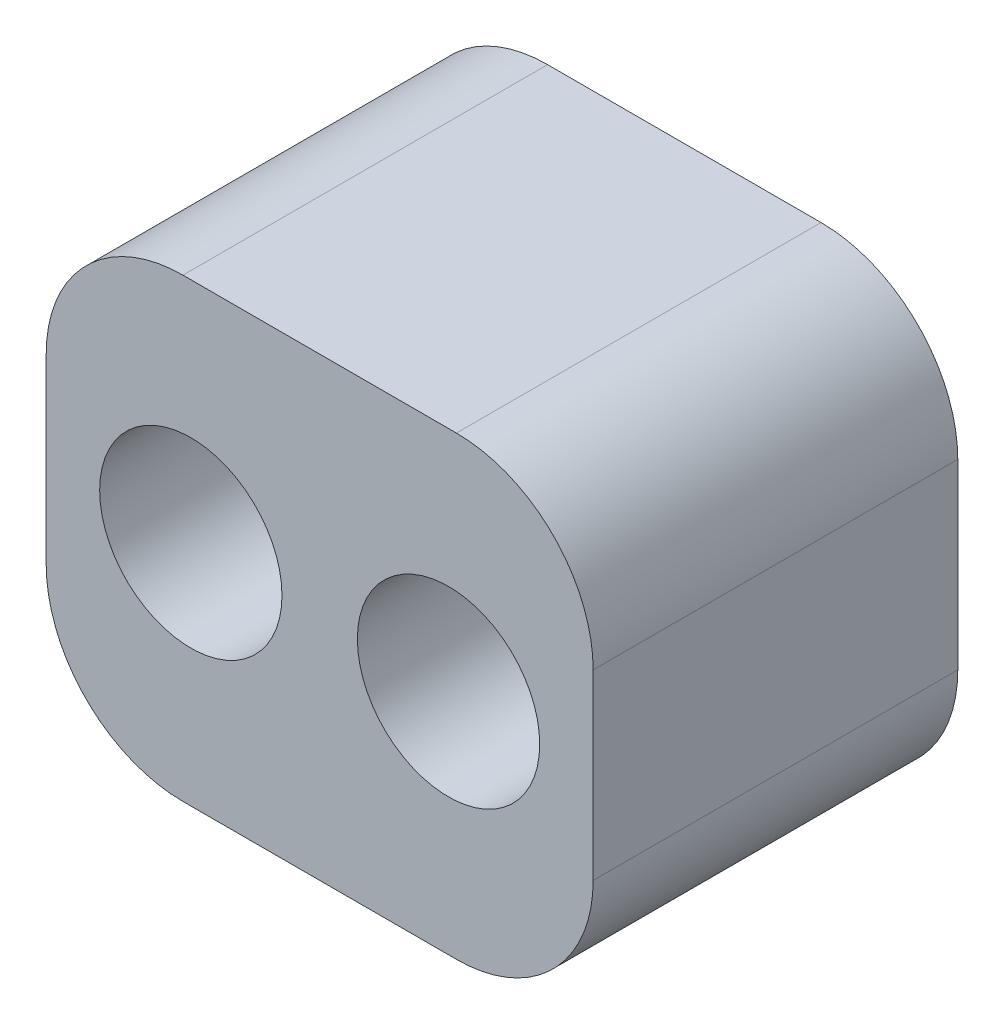
ISO-10303-21;
HEADER;
FILE_DESCRIPTION(('STEP AP214'),'2;1');
FILE_NAME('part.step','',(''),(''),'','','');
FILE_SCHEMA(('AUTOMOTIVE_DESIGN { 1 0 10303 214 1 1 1 1 }'));
ENDSEC;
DATA;
#1=APPLICATION_CONTEXT('core data for automotive mechanical design processes');
#2=APPLICATION_PROTOCOL_DEFINITION('international standard','automotive_design',2000,#1);
#3=PRODUCT_CONTEXT('',#1,'mechanical');
#4=PRODUCT('Part','Part','',(#3));
#5=PRODUCT_RELATED_PRODUCT_CATEGORY('part','',(#4));
#6=PRODUCT_DEFINITION_FORMATION('','',#4);
#7=PRODUCT_DEFINITION_CONTEXT('part definition',#1,'design');
#8=PRODUCT_DEFINITION('design','',#6,#7);
#9=PRODUCT_DEFINITION_SHAPE('','',#8);
#10=(LENGTH_UNIT() NAMED_UNIT(*) SI_UNIT(.MILLI.,.METRE.));
#11=(NAMED_UNIT(*) PLANE_ANGLE_UNIT() SI_UNIT($,.RADIAN.));
#12=(NAMED_UNIT(*) SI_UNIT($,.STERADIAN.) SOLID_ANGLE_UNIT());
#13=UNCERTAINTY_MEASURE_WITH_UNIT(LENGTH_MEASURE(1.E-05),#10,'distance_accuracy_value','');
#14=(GEOMETRIC_REPRESENTATION_CONTEXT(3) GLOBAL_UNCERTAINTY_ASSIGNED_CONTEXT((#13)) GLOBAL_UNIT_ASSIGNED_CONTEXT((#10,
#11,#12)) REPRESENTATION_CONTEXT('',''));
#15=CARTESIAN_POINT('',(0.,0.,0.));
#16=DIRECTION('',(0.,0.,1.));
#17=DIRECTION('',(1.,0.,0.));
#18=AXIS2_PLACEMENT_3D('',#15,#16,#17);
#19=CARTESIAN_POINT('',(0.,0.,4.));
#20=DIRECTION('',(0.,0.,1.));
#21=DIRECTION('',(1.,0.,0.));
#22=AXIS2_PLACEMENT_3D('',#19,#20,#21);
#23=PLANE('',#22);
#24=CARTESIAN_POINT('',(1.41362554394618,0.,4.));
#25=DIRECTION('',(0.,0.,1.));
#26=DIRECTION('',(1.,0.,0.));
#27=AXIS2_PLACEMENT_3D('',#24,#25,#26);
#28=CIRCLE('',#27,1.);
#29=CARTESIAN_POINT('',(2.41362554394618,0.,4.));
#30=VERTEX_POINT('',#29);
#31=EDGE_CURVE('E135',#30,#30,#28,.T.);
#32=ORIENTED_EDGE('',*,*,#31,.F.);
#33=EDGE_LOOP('',(#32));
#34=FACE_BOUND('',#33,.T.);
#35=DIRECTION('',(1.,0.,0.));
#36=VECTOR('',#35,1.);
#37=CARTESIAN_POINT('',(-3.,-2.5,4.));
#38=LINE('',#37,#36);
#39=CARTESIAN_POINT('',(-1.5,-2.5,4.));
#40=VERTEX_POINT('',#39);
#41=CARTESIAN_POINT('',(1.5,-2.5,4.));
#42=VERTEX_POINT('',#41);
#43=EDGE_CURVE('E144',#40,#42,#38,.T.);
#44=ORIENTED_EDGE('',*,*,#43,.T.);
#45=CARTESIAN_POINT('',(1.5,-1.,4.));
#46=DIRECTION('',(0.,0.,1.));
#47=DIRECTION('',(1.,0.,0.));
#48=AXIS2_PLACEMENT_3D('',#45,#46,#47);
#49=CIRCLE('',#48,1.5);
#50=CARTESIAN_POINT('',(3.,-1.,4.));
#51=VERTEX_POINT('',#50);
#52=EDGE_CURVE('E162',#42,#51,#49,.T.);
#53=ORIENTED_EDGE('',*,*,#52,.T.);
#54=DIRECTION('',(0.,1.,0.));
#55=VECTOR('',#54,1.);
#56=CARTESIAN_POINT('',(3.,2.5,4.));
#57=LINE('',#56,#55);
#58=CARTESIAN_POINT('',(3.,1.,4.));
#59=VERTEX_POINT('',#58);
#60=EDGE_CURVE('E126',#51,#59,#57,.T.);
#61=ORIENTED_EDGE('',*,*,#60,.T.);
#62=CARTESIAN_POINT('',(1.5,1.,4.));
#63=DIRECTION('',(0.,0.,1.));
#64=DIRECTION('',(1.,0.,0.));
#65=AXIS2_PLACEMENT_3D('',#62,#63,#64);
#66=CIRCLE('',#65,1.5);
#67=CARTESIAN_POINT('',(1.5,2.5,4.));
#68=VERTEX_POINT('',#67);
#69=EDGE_CURVE('E158',#59,#68,#66,.T.);
#70=ORIENTED_EDGE('',*,*,#69,.T.);
#71=DIRECTION('',(-1.,0.,0.));
#72=VECTOR('',#71,1.);
#73=CARTESIAN_POINT('',(-3.,2.5,4.));
#74=LINE('',#73,#72);
#75=CARTESIAN_POINT('',(-1.5,2.5,4.));
#76=VERTEX_POINT('',#75);
#77=EDGE_CURVE('E171',#68,#76,#74,.T.);
#78=ORIENTED_EDGE('',*,*,#77,.T.);
#79=CARTESIAN_POINT('',(-1.5,1.,4.));
#80=DIRECTION('',(0.,0.,1.));
#81=DIRECTION('',(1.,0.,0.));
#82=AXIS2_PLACEMENT_3D('',#79,#80,#81);
#83=CIRCLE('',#82,1.5);
#84=CARTESIAN_POINT('',(-3.,1.,4.));
#85=VERTEX_POINT('',#84);
#86=EDGE_CURVE('E61',#76,#85,#83,.T.);
#87=ORIENTED_EDGE('',*,*,#86,.T.);
#88=DIRECTION('',(0.,-1.,0.));
#89=VECTOR('',#88,1.);
#90=CARTESIAN_POINT('',(-3.,2.5,4.));
#91=LINE('',#90,#89);
#92=CARTESIAN_POINT('',(-3.,-1.,4.));
#93=VERTEX_POINT('',#92);
#94=EDGE_CURVE('E177',#85,#93,#91,.T.);
#95=ORIENTED_EDGE('',*,*,#94,.T.);
#96=CARTESIAN_POINT('',(-1.5,-1.,4.));
#97=DIRECTION('',(0.,0.,1.));
#98=DIRECTION('',(1.,0.,0.));
#99=AXIS2_PLACEMENT_3D('',#96,#97,#98);
#100=CIRCLE('',#99,1.5);
#101=EDGE_CURVE('E160',#93,#40,#100,.T.);
#102=ORIENTED_EDGE('',*,*,#101,.T.);
#103=EDGE_LOOP('',(#44,#53,#61,#70,#78,#87,#95,#102));
#104=FACE_BOUND('',#103,.T.);
#105=CARTESIAN_POINT('',(-1.41362554394618,0.,4.));
#106=DIRECTION('',(0.,0.,1.));
#107=DIRECTION('',(-1.,0.,0.));
#108=AXIS2_PLACEMENT_3D('',#105,#106,#107);
#109=CIRCLE('',#108,1.);
#110=CARTESIAN_POINT('',(-2.41362554394618,0.,4.));
#111=VERTEX_POINT('',#110);
#112=EDGE_CURVE('E192',#111,#111,#109,.T.);
#113=ORIENTED_EDGE('',*,*,#112,.F.);
#114=EDGE_LOOP('',(#113));
#115=FACE_BOUND('',#114,.T.);
#116=ADVANCED_FACE('F39',(#34,#104,#115),#23,.T.);
#117=CARTESIAN_POINT('',(0.,0.,0.));
#118=DIRECTION('',(0.,0.,1.));
#119=DIRECTION('',(1.,0.,0.));
#120=AXIS2_PLACEMENT_3D('',#117,#118,#119);
#121=PLANE('',#120);
#122=DIRECTION('',(0.,1.,0.));
#123=VECTOR('',#122,1.);
#124=CARTESIAN_POINT('',(3.,2.5,0.));
#125=LINE('',#124,#123);
#126=CARTESIAN_POINT('',(3.,-1.,0.));
#127=VERTEX_POINT('',#126);
#128=CARTESIAN_POINT('',(3.,1.,0.));
#129=VERTEX_POINT('',#128);
#130=EDGE_CURVE('E123',#127,#129,#125,.T.);
#131=ORIENTED_EDGE('',*,*,#130,.F.);
#132=CARTESIAN_POINT('',(1.5,-1.,0.));
#133=DIRECTION('',(0.,0.,1.));
#134=DIRECTION('',(1.,0.,0.));
#135=AXIS2_PLACEMENT_3D('',#132,#133,#134);
#136=CIRCLE('',#135,1.5);
#137=CARTESIAN_POINT('',(1.5,-2.5,0.));
#138=VERTEX_POINT('',#137);
#139=EDGE_CURVE('E106',#127,#138,#136,.F.);
#140=ORIENTED_EDGE('',*,*,#139,.T.);
#141=DIRECTION('',(1.,0.,0.));
#142=VECTOR('',#141,1.);
#143=CARTESIAN_POINT('',(-3.,-2.5,0.));
#144=LINE('',#143,#142);
#145=CARTESIAN_POINT('',(-1.5,-2.5,0.));
#146=VERTEX_POINT('',#145);
#147=EDGE_CURVE('E148',#146,#138,#144,.T.);
#148=ORIENTED_EDGE('',*,*,#147,.F.);
#149=CARTESIAN_POINT('',(-1.5,-1.,0.));
#150=DIRECTION('',(0.,0.,1.));
#151=DIRECTION('',(1.,0.,0.));
#152=AXIS2_PLACEMENT_3D('',#149,#150,#151);
#153=CIRCLE('',#152,1.5);
#154=CARTESIAN_POINT('',(-3.,-1.,0.));
#155=VERTEX_POINT('',#154);
#156=EDGE_CURVE('E117',#146,#155,#153,.F.);
#157=ORIENTED_EDGE('',*,*,#156,.T.);
#158=DIRECTION('',(0.,-1.,0.));
#159=VECTOR('',#158,1.);
#160=CARTESIAN_POINT('',(-3.,2.5,0.));
#161=LINE('',#160,#159);
#162=CARTESIAN_POINT('',(-3.,1.,0.));
#163=VERTEX_POINT('',#162);
#164=EDGE_CURVE('E138',#163,#155,#161,.T.);
#165=ORIENTED_EDGE('',*,*,#164,.F.);
#166=CARTESIAN_POINT('',(-1.5,1.,0.));
#167=DIRECTION('',(0.,0.,1.));
#168=DIRECTION('',(1.,0.,0.));
#169=AXIS2_PLACEMENT_3D('',#166,#167,#168);
#170=CIRCLE('',#169,1.5);
#171=CARTESIAN_POINT('',(-1.5,2.5,0.));
#172=VERTEX_POINT('',#171);
#173=EDGE_CURVE('E127',#163,#172,#170,.F.);
#174=ORIENTED_EDGE('',*,*,#173,.T.);
#175=DIRECTION('',(-1.,0.,0.));
#176=VECTOR('',#175,1.);
#177=CARTESIAN_POINT('',(-3.,2.5,0.));
#178=LINE('',#177,#176);
#179=CARTESIAN_POINT('',(1.5,2.5,0.));
#180=VERTEX_POINT('',#179);
#181=EDGE_CURVE('E134',#180,#172,#178,.T.);
#182=ORIENTED_EDGE('',*,*,#181,.F.);
#183=CARTESIAN_POINT('',(1.5,1.,0.));
#184=DIRECTION('',(0.,0.,1.));
#185=DIRECTION('',(1.,0.,0.));
#186=AXIS2_PLACEMENT_3D('',#183,#184,#185);
#187=CIRCLE('',#186,1.5);
#188=EDGE_CURVE('E133',#180,#129,#187,.F.);
#189=ORIENTED_EDGE('',*,*,#188,.T.);
#190=EDGE_LOOP('',(#131,#140,#148,#157,#165,#174,#182,#189));
#191=FACE_BOUND('',#190,.T.);
#192=CARTESIAN_POINT('',(1.41362554394618,0.,0.));
#193=DIRECTION('',(0.,0.,1.));
#194=DIRECTION('',(1.,0.,0.));
#195=AXIS2_PLACEMENT_3D('',#192,#193,#194);
#196=CIRCLE('',#195,1.);
#197=CARTESIAN_POINT('',(2.41362554394618,0.,0.));
#198=VERTEX_POINT('',#197);
#199=EDGE_CURVE('E141',#198,#198,#196,.T.);
#200=ORIENTED_EDGE('',*,*,#199,.T.);
#201=EDGE_LOOP('',(#200));
#202=FACE_BOUND('',#201,.T.);
#203=CARTESIAN_POINT('',(-1.41362554394618,0.,0.));
#204=DIRECTION('',(0.,0.,1.));
#205=DIRECTION('',(-1.,0.,0.));
#206=AXIS2_PLACEMENT_3D('',#203,#204,#205);
#207=CIRCLE('',#206,1.);
#208=CARTESIAN_POINT('',(-2.41362554394618,0.,0.));
#209=VERTEX_POINT('',#208);
#210=EDGE_CURVE('E194',#209,#209,#207,.T.);
#211=ORIENTED_EDGE('',*,*,#210,.T.);
#212=EDGE_LOOP('',(#211));
#213=FACE_BOUND('',#212,.T.);
#214=ADVANCED_FACE('F130',(#191,#202,#213),#121,.F.);
#215=CARTESIAN_POINT('',(3.,2.5,4.));
#216=DIRECTION('',(-1.,0.,0.));
#217=DIRECTION('',(0.,0.,1.));
#218=AXIS2_PLACEMENT_3D('',#215,#216,#217);
#219=PLANE('',#218);
#220=ORIENTED_EDGE('',*,*,#60,.F.);
#221=DIRECTION('',(0.,0.,-1.));
#222=VECTOR('',#221,1.);
#223=CARTESIAN_POINT('',(3.,-1.,4.));
#224=LINE('',#223,#222);
#225=EDGE_CURVE('E110',#51,#127,#224,.T.);
#226=ORIENTED_EDGE('',*,*,#225,.T.);
#227=ORIENTED_EDGE('',*,*,#130,.T.);
#228=DIRECTION('',(0.,0.,-1.));
#229=VECTOR('',#228,1.);
#230=CARTESIAN_POINT('',(3.,1.,4.));
#231=LINE('',#230,#229);
#232=EDGE_CURVE('E128',#129,#59,#231,.F.);
#233=ORIENTED_EDGE('',*,*,#232,.T.);
#234=EDGE_LOOP('',(#220,#226,#227,#233));
#235=FACE_BOUND('',#234,.T.);
#236=ADVANCED_FACE('F122',(#235),#219,.F.);
#237=CARTESIAN_POINT('',(-3.,2.5,4.));
#238=DIRECTION('',(0.,-1.,0.));
#239=DIRECTION('',(0.,0.,-1.));
#240=AXIS2_PLACEMENT_3D('',#237,#238,#239);
#241=PLANE('',#240);
#242=ORIENTED_EDGE('',*,*,#77,.F.);
#243=DIRECTION('',(0.,0.,-1.));
#244=VECTOR('',#243,1.);
#245=CARTESIAN_POINT('',(1.5,2.5,4.));
#246=LINE('',#245,#244);
#247=EDGE_CURVE('E11',#68,#180,#246,.T.);
#248=ORIENTED_EDGE('',*,*,#247,.T.);
#249=ORIENTED_EDGE('',*,*,#181,.T.);
#250=DIRECTION('',(0.,0.,-1.));
#251=VECTOR('',#250,1.);
#252=CARTESIAN_POINT('',(-1.5,2.5,4.));
#253=LINE('',#252,#251);
#254=EDGE_CURVE('E47',#172,#76,#253,.F.);
#255=ORIENTED_EDGE('',*,*,#254,.T.);
#256=EDGE_LOOP('',(#242,#248,#249,#255));
#257=FACE_BOUND('',#256,.T.);
#258=ADVANCED_FACE('F170',(#257),#241,.F.);
#259=CARTESIAN_POINT('',(-3.,2.5,4.));
#260=DIRECTION('',(1.,0.,0.));
#261=DIRECTION('',(0.,0.,-1.));
#262=AXIS2_PLACEMENT_3D('',#259,#260,#261);
#263=PLANE('',#262);
#264=ORIENTED_EDGE('',*,*,#164,.T.);
#265=DIRECTION('',(0.,0.,-1.));
#266=VECTOR('',#265,1.);
#267=CARTESIAN_POINT('',(-3.,-1.,4.));
#268=LINE('',#267,#266);
#269=EDGE_CURVE('E54',#155,#93,#268,.F.);
#270=ORIENTED_EDGE('',*,*,#269,.T.);
#271=ORIENTED_EDGE('',*,*,#94,.F.);
#272=DIRECTION('',(0.,0.,-1.));
#273=VECTOR('',#272,1.);
#274=CARTESIAN_POINT('',(-3.,1.,4.));
#275=LINE('',#274,#273);
#276=EDGE_CURVE('E164',#85,#163,#275,.T.);
#277=ORIENTED_EDGE('',*,*,#276,.T.);
#278=EDGE_LOOP('',(#264,#270,#271,#277));
#279=FACE_BOUND('',#278,.T.);
#280=ADVANCED_FACE('F181',(#279),#263,.F.);
#281=CARTESIAN_POINT('',(-3.,-2.5,4.));
#282=DIRECTION('',(0.,1.,0.));
#283=DIRECTION('',(0.,0.,1.));
#284=AXIS2_PLACEMENT_3D('',#281,#282,#283);
#285=PLANE('',#284);
#286=ORIENTED_EDGE('',*,*,#147,.T.);
#287=DIRECTION('',(0.,0.,-1.));
#288=VECTOR('',#287,1.);
#289=CARTESIAN_POINT('',(1.5,-2.5,4.));
#290=LINE('',#289,#288);
#291=EDGE_CURVE('E111',#138,#42,#290,.F.);
#292=ORIENTED_EDGE('',*,*,#291,.T.);
#293=ORIENTED_EDGE('',*,*,#43,.F.);
#294=DIRECTION('',(0.,0.,-1.));
#295=VECTOR('',#294,1.);
#296=CARTESIAN_POINT('',(-1.5,-2.5,4.));
#297=LINE('',#296,#295);
#298=EDGE_CURVE('E116',#40,#146,#297,.T.);
#299=ORIENTED_EDGE('',*,*,#298,.T.);
#300=EDGE_LOOP('',(#286,#292,#293,#299));
#301=FACE_BOUND('',#300,.T.);
#302=ADVANCED_FACE('F188',(#301),#285,.F.);
#303=CARTESIAN_POINT('',(1.41362554394618,0.,4.));
#304=DIRECTION('',(0.,0.,-1.));
#305=DIRECTION('',(-1.,0.,0.));
#306=AXIS2_PLACEMENT_3D('',#303,#304,#305);
#307=CYLINDRICAL_SURFACE('',#306,1.);
#308=ORIENTED_EDGE('',*,*,#31,.T.);
#309=EDGE_LOOP('',(#308));
#310=FACE_BOUND('',#309,.T.);
#311=ORIENTED_EDGE('',*,*,#199,.F.);
#312=EDGE_LOOP('',(#311));
#313=FACE_BOUND('',#312,.T.);
#314=ADVANCED_FACE('F212',(#310,#313),#307,.F.);
#315=CARTESIAN_POINT('',(-1.41362554394618,0.,4.));
#316=DIRECTION('',(0.,0.,-1.));
#317=DIRECTION('',(-1.,0.,0.));
#318=AXIS2_PLACEMENT_3D('',#315,#316,#317);
#319=CYLINDRICAL_SURFACE('',#318,1.);
#320=ORIENTED_EDGE('',*,*,#112,.T.);
#321=EDGE_LOOP('',(#320));
#322=FACE_BOUND('',#321,.T.);
#323=ORIENTED_EDGE('',*,*,#210,.F.);
#324=EDGE_LOOP('',(#323));
#325=FACE_BOUND('',#324,.T.);
#326=ADVANCED_FACE('F200',(#322,#325),#319,.F.);
#327=CARTESIAN_POINT('',(1.5,-1.,4.));
#328=DIRECTION('',(0.,0.,-1.));
#329=DIRECTION('',(-1.,0.,0.));
#330=AXIS2_PLACEMENT_3D('',#327,#328,#329);
#331=CYLINDRICAL_SURFACE('',#330,1.5);
#332=ORIENTED_EDGE('',*,*,#52,.F.);
#333=ORIENTED_EDGE('',*,*,#291,.F.);
#334=ORIENTED_EDGE('',*,*,#139,.F.);
#335=ORIENTED_EDGE('',*,*,#225,.F.);
#336=EDGE_LOOP('',(#332,#333,#334,#335));
#337=FACE_BOUND('',#336,.T.);
#338=ADVANCED_FACE('F109',(#337),#331,.T.);
#339=CARTESIAN_POINT('',(-1.5,-1.,4.));
#340=DIRECTION('',(0.,0.,-1.));
#341=DIRECTION('',(-1.,0.,0.));
#342=AXIS2_PLACEMENT_3D('',#339,#340,#341);
#343=CYLINDRICAL_SURFACE('',#342,1.5);
#344=ORIENTED_EDGE('',*,*,#101,.F.);
#345=ORIENTED_EDGE('',*,*,#269,.F.);
#346=ORIENTED_EDGE('',*,*,#156,.F.);
#347=ORIENTED_EDGE('',*,*,#298,.F.);
#348=EDGE_LOOP('',(#344,#345,#346,#347));
#349=FACE_BOUND('',#348,.T.);
#350=ADVANCED_FACE('F185',(#349),#343,.T.);
#351=CARTESIAN_POINT('',(1.5,1.,4.));
#352=DIRECTION('',(0.,0.,-1.));
#353=DIRECTION('',(-1.,0.,0.));
#354=AXIS2_PLACEMENT_3D('',#351,#352,#353);
#355=CYLINDRICAL_SURFACE('',#354,1.5);
#356=ORIENTED_EDGE('',*,*,#69,.F.);
#357=ORIENTED_EDGE('',*,*,#232,.F.);
#358=ORIENTED_EDGE('',*,*,#188,.F.);
#359=ORIENTED_EDGE('',*,*,#247,.F.);
#360=EDGE_LOOP('',(#356,#357,#358,#359));
#361=FACE_BOUND('',#360,.T.);
#362=ADVANCED_FACE('F226',(#361),#355,.T.);
#363=CARTESIAN_POINT('',(-1.5,1.,4.));
#364=DIRECTION('',(0.,0.,-1.));
#365=DIRECTION('',(-1.,0.,0.));
#366=AXIS2_PLACEMENT_3D('',#363,#364,#365);
#367=CYLINDRICAL_SURFACE('',#366,1.5);
#368=ORIENTED_EDGE('',*,*,#86,.F.);
#369=ORIENTED_EDGE('',*,*,#254,.F.);
#370=ORIENTED_EDGE('',*,*,#173,.F.);
#371=ORIENTED_EDGE('',*,*,#276,.F.);
#372=EDGE_LOOP('',(#368,#369,#370,#371));
#373=FACE_BOUND('',#372,.T.);
#374=ADVANCED_FACE('F41',(#373),#367,.T.);
#375=CLOSED_SHELL('',(#116,#214,#236,#258,#280,#302,#314,#326,#338,#350,#362,#374));
#376=MANIFOLD_SOLID_BREP('B2',#375);
#377=ADVANCED_BREP_SHAPE_REPRESENTATION('',(#18,#376),#14);
#378=SHAPE_DEFINITION_REPRESENTATION(#9,#377);
ENDSEC;
END-ISO-10303-21;
